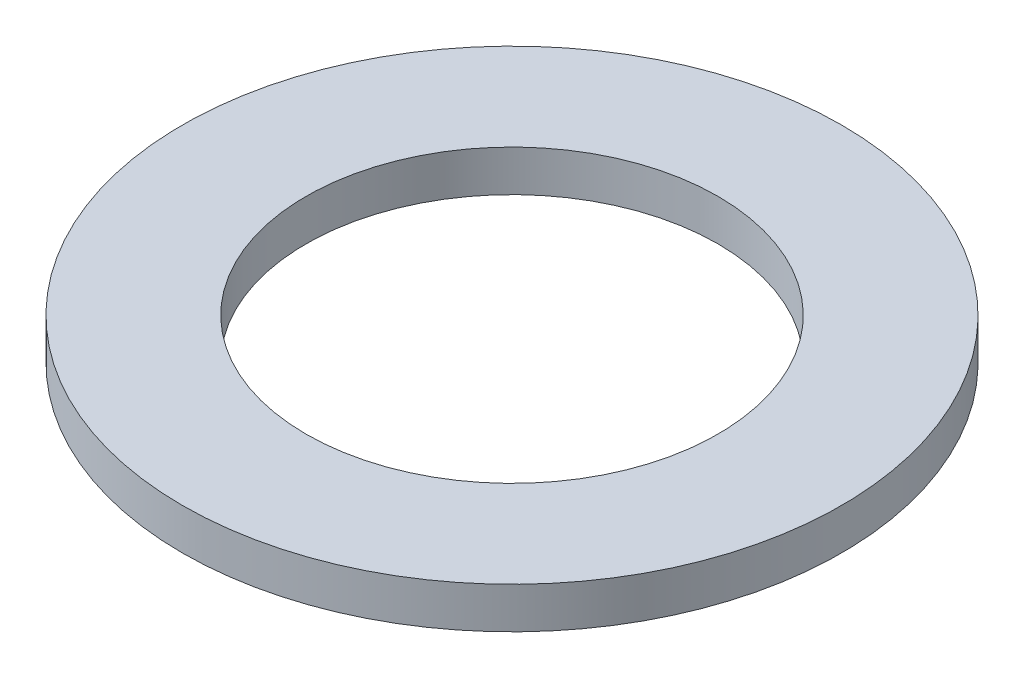
ISO-10303-21;
HEADER;
FILE_DESCRIPTION(('STEP AP214'),'2;1');
FILE_NAME('part.step','',(''),(''),'','','');
FILE_SCHEMA(('AUTOMOTIVE_DESIGN { 1 0 10303 214 1 1 1 1 }'));
ENDSEC;
DATA;
#1=APPLICATION_CONTEXT('core data for automotive mechanical design processes');
#2=APPLICATION_PROTOCOL_DEFINITION('international standard','automotive_design',2000,#1);
#3=PRODUCT_CONTEXT('',#1,'mechanical');
#4=PRODUCT('Part','Part','',(#3));
#5=PRODUCT_RELATED_PRODUCT_CATEGORY('part','',(#4));
#6=PRODUCT_DEFINITION_FORMATION('','',#4);
#7=PRODUCT_DEFINITION_CONTEXT('part definition',#1,'design');
#8=PRODUCT_DEFINITION('design','',#6,#7);
#9=PRODUCT_DEFINITION_SHAPE('','',#8);
#10=(LENGTH_UNIT() NAMED_UNIT(*) SI_UNIT(.MILLI.,.METRE.));
#11=(NAMED_UNIT(*) PLANE_ANGLE_UNIT() SI_UNIT($,.RADIAN.));
#12=(NAMED_UNIT(*) SI_UNIT($,.STERADIAN.) SOLID_ANGLE_UNIT());
#13=UNCERTAINTY_MEASURE_WITH_UNIT(LENGTH_MEASURE(1.E-05),#10,'distance_accuracy_value','');
#14=(GEOMETRIC_REPRESENTATION_CONTEXT(3) GLOBAL_UNCERTAINTY_ASSIGNED_CONTEXT((#13)) GLOBAL_UNIT_ASSIGNED_CONTEXT((#10,
#11,#12)) REPRESENTATION_CONTEXT('',''));
#15=CARTESIAN_POINT('',(0.,0.,0.));
#16=DIRECTION('',(0.,0.,1.));
#17=DIRECTION('',(1.,0.,0.));
#18=AXIS2_PLACEMENT_3D('',#15,#16,#17);
#19=CARTESIAN_POINT('',(0.,0.5,0.));
#20=DIRECTION('',(0.,1.,0.));
#21=DIRECTION('',(0.,0.,1.));
#22=AXIS2_PLACEMENT_3D('',#19,#20,#21);
#23=PLANE('',#22);
#24=CARTESIAN_POINT('',(0.,0.5,0.));
#25=DIRECTION('',(0.,1.,0.));
#26=DIRECTION('',(0.,0.,1.));
#27=AXIS2_PLACEMENT_3D('',#24,#25,#26);
#28=CIRCLE('',#27,4.);
#29=CARTESIAN_POINT('',(0.,0.5,4.));
#30=VERTEX_POINT('',#29);
#31=EDGE_CURVE('E10',#30,#30,#28,.T.);
#32=ORIENTED_EDGE('',*,*,#31,.T.);
#33=EDGE_LOOP('',(#32));
#34=FACE_BOUND('',#33,.T.);
#35=CARTESIAN_POINT('',(0.,0.5,0.));
#36=DIRECTION('',(0.,1.,0.));
#37=DIRECTION('',(0.,0.,1.));
#38=AXIS2_PLACEMENT_3D('',#35,#36,#37);
#39=CIRCLE('',#38,2.5);
#40=CARTESIAN_POINT('',(0.,0.5,2.5));
#41=VERTEX_POINT('',#40);
#42=EDGE_CURVE('E28',#41,#41,#39,.T.);
#43=ORIENTED_EDGE('',*,*,#42,.F.);
#44=EDGE_LOOP('',(#43));
#45=FACE_BOUND('',#44,.T.);
#46=ADVANCED_FACE('F14',(#34,#45),#23,.T.);
#47=CARTESIAN_POINT('',(0.,0.,0.));
#48=DIRECTION('',(0.,1.,0.));
#49=DIRECTION('',(0.,0.,1.));
#50=AXIS2_PLACEMENT_3D('',#47,#48,#49);
#51=PLANE('',#50);
#52=CARTESIAN_POINT('',(0.,0.,0.));
#53=DIRECTION('',(0.,1.,0.));
#54=DIRECTION('',(0.,0.,1.));
#55=AXIS2_PLACEMENT_3D('',#52,#53,#54);
#56=CIRCLE('',#55,4.);
#57=CARTESIAN_POINT('',(0.,0.,4.));
#58=VERTEX_POINT('',#57);
#59=EDGE_CURVE('E18',#58,#58,#56,.T.);
#60=ORIENTED_EDGE('',*,*,#59,.F.);
#61=EDGE_LOOP('',(#60));
#62=FACE_BOUND('',#61,.T.);
#63=CARTESIAN_POINT('',(0.,0.,0.));
#64=DIRECTION('',(0.,1.,0.));
#65=DIRECTION('',(0.,0.,1.));
#66=AXIS2_PLACEMENT_3D('',#63,#64,#65);
#67=CIRCLE('',#66,2.5);
#68=CARTESIAN_POINT('',(0.,0.,2.5));
#69=VERTEX_POINT('',#68);
#70=EDGE_CURVE('E30',#69,#69,#67,.T.);
#71=ORIENTED_EDGE('',*,*,#70,.T.);
#72=EDGE_LOOP('',(#71));
#73=FACE_BOUND('',#72,.T.);
#74=ADVANCED_FACE('F42',(#62,#73),#51,.F.);
#75=CARTESIAN_POINT('',(0.,0.5,0.));
#76=DIRECTION('',(0.,-1.,0.));
#77=DIRECTION('',(0.,0.,-1.));
#78=AXIS2_PLACEMENT_3D('',#75,#76,#77);
#79=CYLINDRICAL_SURFACE('',#78,4.);
#80=ORIENTED_EDGE('',*,*,#31,.F.);
#81=EDGE_LOOP('',(#80));
#82=FACE_BOUND('',#81,.T.);
#83=ORIENTED_EDGE('',*,*,#59,.T.);
#84=EDGE_LOOP('',(#83));
#85=FACE_BOUND('',#84,.T.);
#86=ADVANCED_FACE('F16',(#82,#85),#79,.T.);
#87=CARTESIAN_POINT('',(0.,0.5,0.));
#88=DIRECTION('',(0.,-1.,0.));
#89=DIRECTION('',(0.,0.,-1.));
#90=AXIS2_PLACEMENT_3D('',#87,#88,#89);
#91=CYLINDRICAL_SURFACE('',#90,2.5);
#92=ORIENTED_EDGE('',*,*,#42,.T.);
#93=EDGE_LOOP('',(#92));
#94=FACE_BOUND('',#93,.T.);
#95=ORIENTED_EDGE('',*,*,#70,.F.);
#96=EDGE_LOOP('',(#95));
#97=FACE_BOUND('',#96,.T.);
#98=ADVANCED_FACE('F38',(#94,#97),#91,.F.);
#99=CLOSED_SHELL('',(#46,#74,#86,#98));
#100=MANIFOLD_SOLID_BREP('B1',#99);
#101=ADVANCED_BREP_SHAPE_REPRESENTATION('',(#18,#100),#14);
#102=SHAPE_DEFINITION_REPRESENTATION(#9,#101);
ENDSEC;
END-ISO-10303-21;
